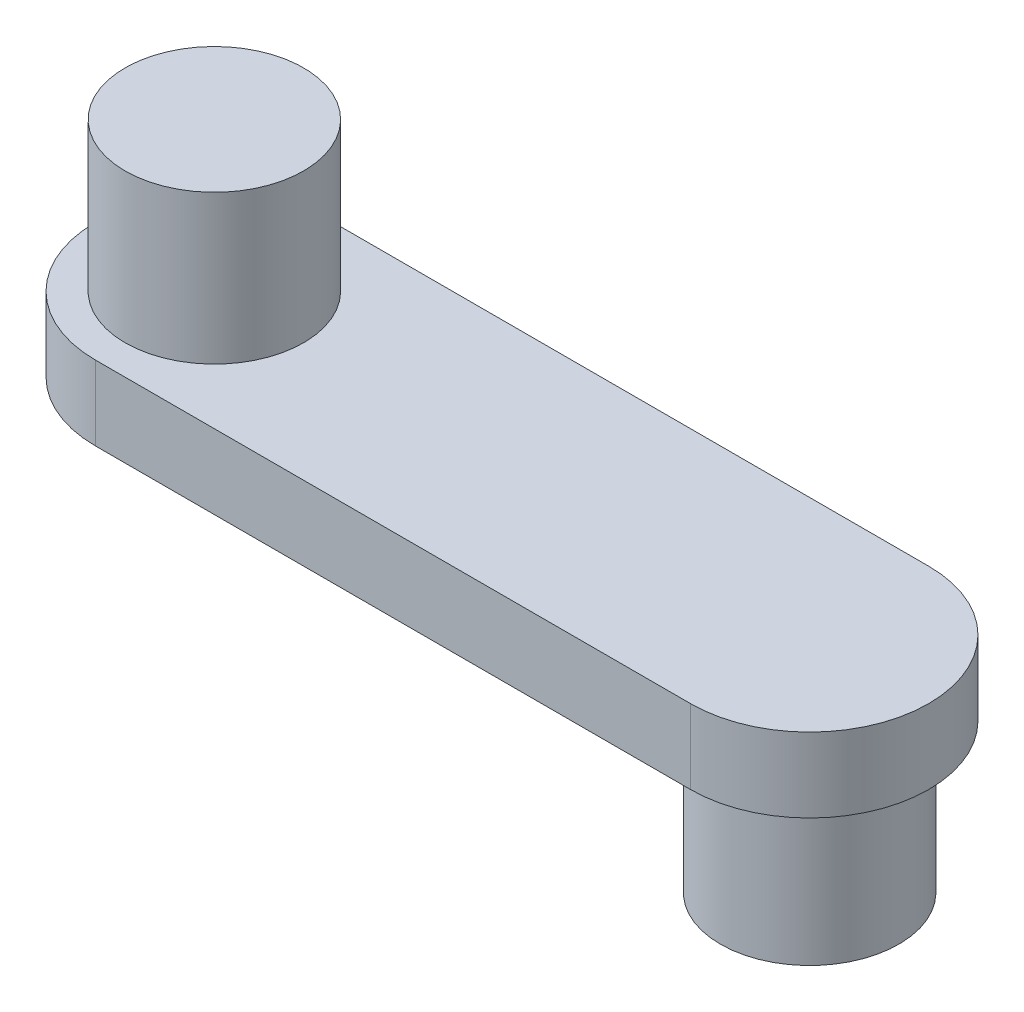
ISO-10303-21;
HEADER;
FILE_DESCRIPTION(('STEP AP214'),'2;1');
FILE_NAME('part.step','',(''),(''),'','','');
FILE_SCHEMA(('AUTOMOTIVE_DESIGN { 1 0 10303 214 1 1 1 1 }'));
ENDSEC;
DATA;
#1=APPLICATION_CONTEXT('core data for automotive mechanical design processes');
#2=APPLICATION_PROTOCOL_DEFINITION('international standard','automotive_design',2000,#1);
#3=PRODUCT_CONTEXT('',#1,'mechanical');
#4=PRODUCT('Part','Part','',(#3));
#5=PRODUCT_RELATED_PRODUCT_CATEGORY('part','',(#4));
#6=PRODUCT_DEFINITION_FORMATION('','',#4);
#7=PRODUCT_DEFINITION_CONTEXT('part definition',#1,'design');
#8=PRODUCT_DEFINITION('design','',#6,#7);
#9=PRODUCT_DEFINITION_SHAPE('','',#8);
#10=(LENGTH_UNIT() NAMED_UNIT(*) SI_UNIT(.MILLI.,.METRE.));
#11=(NAMED_UNIT(*) PLANE_ANGLE_UNIT() SI_UNIT($,.RADIAN.));
#12=(NAMED_UNIT(*) SI_UNIT($,.STERADIAN.) SOLID_ANGLE_UNIT());
#13=UNCERTAINTY_MEASURE_WITH_UNIT(LENGTH_MEASURE(1.E-05),#10,'distance_accuracy_value','');
#14=(GEOMETRIC_REPRESENTATION_CONTEXT(3) GLOBAL_UNCERTAINTY_ASSIGNED_CONTEXT((#13)) GLOBAL_UNIT_ASSIGNED_CONTEXT((#10,
#11,#12)) REPRESENTATION_CONTEXT('',''));
#15=CARTESIAN_POINT('',(0.,0.,0.));
#16=DIRECTION('',(0.,0.,1.));
#17=DIRECTION('',(1.,0.,0.));
#18=AXIS2_PLACEMENT_3D('',#15,#16,#17);
#19=CARTESIAN_POINT('',(0.,5.,8.));
#20=DIRECTION('',(0.,0.,-1.));
#21=DIRECTION('',(-1.,0.,0.));
#22=AXIS2_PLACEMENT_3D('',#19,#20,#21);
#23=PLANE('',#22);
#24=DIRECTION('',(1.,0.,0.));
#25=VECTOR('',#24,1.);
#26=CARTESIAN_POINT('',(0.,0.,8.));
#27=LINE('',#26,#25);
#28=CARTESIAN_POINT('',(0.,0.,8.));
#29=VERTEX_POINT('',#28);
#30=CARTESIAN_POINT('',(40.,0.,8.));
#31=VERTEX_POINT('',#30);
#32=EDGE_CURVE('E97',#29,#31,#27,.T.);
#33=ORIENTED_EDGE('',*,*,#32,.T.);
#34=DIRECTION('',(0.,-1.,0.));
#35=VECTOR('',#34,1.);
#36=CARTESIAN_POINT('',(40.,5.,8.));
#37=LINE('',#36,#35);
#38=CARTESIAN_POINT('',(40.,5.,8.));
#39=VERTEX_POINT('',#38);
#40=EDGE_CURVE('E11',#39,#31,#37,.T.);
#41=ORIENTED_EDGE('',*,*,#40,.F.);
#42=DIRECTION('',(1.,0.,0.));
#43=VECTOR('',#42,1.);
#44=CARTESIAN_POINT('',(0.,5.,8.));
#45=LINE('',#44,#43);
#46=CARTESIAN_POINT('',(0.,5.,8.));
#47=VERTEX_POINT('',#46);
#48=EDGE_CURVE('E82',#47,#39,#45,.T.);
#49=ORIENTED_EDGE('',*,*,#48,.F.);
#50=DIRECTION('',(0.,-1.,0.));
#51=VECTOR('',#50,1.);
#52=CARTESIAN_POINT('',(0.,5.,8.));
#53=LINE('',#52,#51);
#54=EDGE_CURVE('E93',#47,#29,#53,.T.);
#55=ORIENTED_EDGE('',*,*,#54,.T.);
#56=EDGE_LOOP('',(#33,#41,#49,#55));
#57=FACE_BOUND('',#56,.T.);
#58=ADVANCED_FACE('F35',(#57),#23,.F.);
#59=CARTESIAN_POINT('',(40.,5.,0.));
#60=DIRECTION('',(0.,-1.,0.));
#61=DIRECTION('',(0.,0.,-1.));
#62=AXIS2_PLACEMENT_3D('',#59,#60,#61);
#63=CYLINDRICAL_SURFACE('',#62,8.);
#64=CARTESIAN_POINT('',(40.,0.,0.));
#65=DIRECTION('',(0.,1.,0.));
#66=DIRECTION('',(0.,0.,1.));
#67=AXIS2_PLACEMENT_3D('',#64,#65,#66);
#68=CIRCLE('',#67,8.);
#69=CARTESIAN_POINT('',(40.,0.,-8.));
#70=VERTEX_POINT('',#69);
#71=EDGE_CURVE('E87',#31,#70,#68,.T.);
#72=ORIENTED_EDGE('',*,*,#71,.T.);
#73=DIRECTION('',(0.,-1.,0.));
#74=VECTOR('',#73,1.);
#75=CARTESIAN_POINT('',(40.,5.,-8.));
#76=LINE('',#75,#74);
#77=CARTESIAN_POINT('',(40.,5.,-8.));
#78=VERTEX_POINT('',#77);
#79=EDGE_CURVE('E43',#78,#70,#76,.T.);
#80=ORIENTED_EDGE('',*,*,#79,.F.);
#81=CARTESIAN_POINT('',(40.,5.,0.));
#82=DIRECTION('',(0.,1.,0.));
#83=DIRECTION('',(0.,0.,1.));
#84=AXIS2_PLACEMENT_3D('',#81,#82,#83);
#85=CIRCLE('',#84,8.);
#86=EDGE_CURVE('E77',#39,#78,#85,.T.);
#87=ORIENTED_EDGE('',*,*,#86,.F.);
#88=ORIENTED_EDGE('',*,*,#40,.T.);
#89=EDGE_LOOP('',(#72,#80,#87,#88));
#90=FACE_BOUND('',#89,.T.);
#91=ADVANCED_FACE('F86',(#90),#63,.T.);
#92=CARTESIAN_POINT('',(0.,5.,-8.));
#93=DIRECTION('',(0.,0.,-1.));
#94=DIRECTION('',(-1.,0.,0.));
#95=AXIS2_PLACEMENT_3D('',#92,#93,#94);
#96=PLANE('',#95);
#97=DIRECTION('',(1.,0.,0.));
#98=VECTOR('',#97,1.);
#99=CARTESIAN_POINT('',(0.,0.,-8.));
#100=LINE('',#99,#98);
#101=CARTESIAN_POINT('',(0.,0.,-8.));
#102=VERTEX_POINT('',#101);
#103=EDGE_CURVE('E102',#102,#70,#100,.T.);
#104=ORIENTED_EDGE('',*,*,#103,.F.);
#105=DIRECTION('',(0.,-1.,0.));
#106=VECTOR('',#105,1.);
#107=CARTESIAN_POINT('',(0.,5.,-8.));
#108=LINE('',#107,#106);
#109=CARTESIAN_POINT('',(0.,5.,-8.));
#110=VERTEX_POINT('',#109);
#111=EDGE_CURVE('E67',#110,#102,#108,.T.);
#112=ORIENTED_EDGE('',*,*,#111,.F.);
#113=DIRECTION('',(1.,0.,0.));
#114=VECTOR('',#113,1.);
#115=CARTESIAN_POINT('',(0.,5.,-8.));
#116=LINE('',#115,#114);
#117=EDGE_CURVE('E80',#110,#78,#116,.T.);
#118=ORIENTED_EDGE('',*,*,#117,.T.);
#119=ORIENTED_EDGE('',*,*,#79,.T.);
#120=EDGE_LOOP('',(#104,#112,#118,#119));
#121=FACE_BOUND('',#120,.T.);
#122=ADVANCED_FACE('F91',(#121),#96,.T.);
#123=CARTESIAN_POINT('',(0.,5.,0.));
#124=DIRECTION('',(0.,-1.,0.));
#125=DIRECTION('',(0.,0.,-1.));
#126=AXIS2_PLACEMENT_3D('',#123,#124,#125);
#127=CYLINDRICAL_SURFACE('',#126,8.);
#128=CARTESIAN_POINT('',(0.,0.,0.));
#129=DIRECTION('',(0.,1.,0.));
#130=DIRECTION('',(0.,0.,1.));
#131=AXIS2_PLACEMENT_3D('',#128,#129,#130);
#132=CIRCLE('',#131,8.);
#133=EDGE_CURVE('E70',#102,#29,#132,.T.);
#134=ORIENTED_EDGE('',*,*,#133,.T.);
#135=ORIENTED_EDGE('',*,*,#54,.F.);
#136=CARTESIAN_POINT('',(0.,5.,0.));
#137=DIRECTION('',(0.,1.,0.));
#138=DIRECTION('',(0.,0.,1.));
#139=AXIS2_PLACEMENT_3D('',#136,#137,#138);
#140=CIRCLE('',#139,8.);
#141=EDGE_CURVE('E51',#110,#47,#140,.T.);
#142=ORIENTED_EDGE('',*,*,#141,.F.);
#143=ORIENTED_EDGE('',*,*,#111,.T.);
#144=EDGE_LOOP('',(#134,#135,#142,#143));
#145=FACE_BOUND('',#144,.T.);
#146=ADVANCED_FACE('F121',(#145),#127,.T.);
#147=CARTESIAN_POINT('',(0.,5.,0.));
#148=DIRECTION('',(0.,1.,0.));
#149=DIRECTION('',(0.,0.,1.));
#150=AXIS2_PLACEMENT_3D('',#147,#148,#149);
#151=PLANE('',#150);
#152=CARTESIAN_POINT('',(0.,5.,0.));
#153=DIRECTION('',(0.,1.,0.));
#154=DIRECTION('',(0.,0.,1.));
#155=AXIS2_PLACEMENT_3D('',#152,#153,#154);
#156=CIRCLE('',#155,6.);
#157=CARTESIAN_POINT('',(0.,5.,6.));
#158=VERTEX_POINT('',#157);
#159=EDGE_CURVE('E100',#158,#158,#156,.F.);
#160=ORIENTED_EDGE('',*,*,#159,.T.);
#161=EDGE_LOOP('',(#160));
#162=FACE_BOUND('',#161,.T.);
#163=ORIENTED_EDGE('',*,*,#48,.T.);
#164=ORIENTED_EDGE('',*,*,#86,.T.);
#165=ORIENTED_EDGE('',*,*,#117,.F.);
#166=ORIENTED_EDGE('',*,*,#141,.T.);
#167=EDGE_LOOP('',(#163,#164,#165,#166));
#168=FACE_BOUND('',#167,.T.);
#169=ADVANCED_FACE('F78',(#162,#168),#151,.T.);
#170=CARTESIAN_POINT('',(0.,0.,0.));
#171=DIRECTION('',(0.,1.,0.));
#172=DIRECTION('',(0.,0.,1.));
#173=AXIS2_PLACEMENT_3D('',#170,#171,#172);
#174=PLANE('',#173);
#175=CARTESIAN_POINT('',(40.,0.,0.));
#176=DIRECTION('',(0.,1.,0.));
#177=DIRECTION('',(0.,0.,1.));
#178=AXIS2_PLACEMENT_3D('',#175,#176,#177);
#179=CIRCLE('',#178,6.00000000000001);
#180=CARTESIAN_POINT('',(40.,0.,6.00000000000001));
#181=VERTEX_POINT('',#180);
#182=EDGE_CURVE('E190',#181,#181,#179,.T.);
#183=ORIENTED_EDGE('',*,*,#182,.T.);
#184=EDGE_LOOP('',(#183));
#185=FACE_BOUND('',#184,.T.);
#186=ORIENTED_EDGE('',*,*,#32,.F.);
#187=ORIENTED_EDGE('',*,*,#133,.F.);
#188=ORIENTED_EDGE('',*,*,#103,.T.);
#189=ORIENTED_EDGE('',*,*,#71,.F.);
#190=EDGE_LOOP('',(#186,#187,#188,#189));
#191=FACE_BOUND('',#190,.T.);
#192=ADVANCED_FACE('F109',(#185,#191),#174,.F.);
#193=CARTESIAN_POINT('',(0.,15.,0.));
#194=DIRECTION('',(0.,-1.,0.));
#195=DIRECTION('',(0.,0.,-1.));
#196=AXIS2_PLACEMENT_3D('',#193,#194,#195);
#197=CYLINDRICAL_SURFACE('',#196,6.);
#198=ORIENTED_EDGE('',*,*,#159,.F.);
#199=EDGE_LOOP('',(#198));
#200=FACE_BOUND('',#199,.T.);
#201=CARTESIAN_POINT('',(0.,15.,0.));
#202=DIRECTION('',(0.,1.,0.));
#203=DIRECTION('',(0.,0.,1.));
#204=AXIS2_PLACEMENT_3D('',#201,#202,#203);
#205=CIRCLE('',#204,6.);
#206=CARTESIAN_POINT('',(0.,15.,6.));
#207=VERTEX_POINT('',#206);
#208=EDGE_CURVE('E189',#207,#207,#205,.T.);
#209=ORIENTED_EDGE('',*,*,#208,.F.);
#210=EDGE_LOOP('',(#209));
#211=FACE_BOUND('',#210,.T.);
#212=ADVANCED_FACE('F111',(#200,#211),#197,.T.);
#213=CARTESIAN_POINT('',(0.,15.,0.));
#214=DIRECTION('',(0.,1.,0.));
#215=DIRECTION('',(0.,0.,1.));
#216=AXIS2_PLACEMENT_3D('',#213,#214,#215);
#217=PLANE('',#216);
#218=ORIENTED_EDGE('',*,*,#208,.T.);
#219=EDGE_LOOP('',(#218));
#220=FACE_BOUND('',#219,.T.);
#221=ADVANCED_FACE('F118',(#220),#217,.T.);
#222=CARTESIAN_POINT('',(40.,-10.,0.));
#223=DIRECTION('',(0.,1.,0.));
#224=DIRECTION('',(0.,0.,1.));
#225=AXIS2_PLACEMENT_3D('',#222,#223,#224);
#226=CYLINDRICAL_SURFACE('',#225,6.00000000000001);
#227=CARTESIAN_POINT('',(40.,-10.,0.));
#228=DIRECTION('',(0.,1.,0.));
#229=DIRECTION('',(0.,0.,1.));
#230=AXIS2_PLACEMENT_3D('',#227,#228,#229);
#231=CIRCLE('',#230,6.00000000000001);
#232=CARTESIAN_POINT('',(40.,-10.,6.00000000000001));
#233=VERTEX_POINT('',#232);
#234=EDGE_CURVE('E188',#233,#233,#231,.T.);
#235=ORIENTED_EDGE('',*,*,#234,.T.);
#236=EDGE_LOOP('',(#235));
#237=FACE_BOUND('',#236,.T.);
#238=ORIENTED_EDGE('',*,*,#182,.F.);
#239=EDGE_LOOP('',(#238));
#240=FACE_BOUND('',#239,.T.);
#241=ADVANCED_FACE('F158',(#237,#240),#226,.T.);
#242=CARTESIAN_POINT('',(40.,-10.,0.));
#243=DIRECTION('',(0.,1.,0.));
#244=DIRECTION('',(0.,0.,1.));
#245=AXIS2_PLACEMENT_3D('',#242,#243,#244);
#246=PLANE('',#245);
#247=ORIENTED_EDGE('',*,*,#234,.F.);
#248=EDGE_LOOP('',(#247));
#249=FACE_BOUND('',#248,.T.);
#250=ADVANCED_FACE('F172',(#249),#246,.F.);
#251=CLOSED_SHELL('',(#58,#91,#122,#146,#169,#192,#212,#221,#241,#250));
#252=MANIFOLD_SOLID_BREP('B2',#251);
#253=ADVANCED_BREP_SHAPE_REPRESENTATION('',(#18,#252),#14);
#254=SHAPE_DEFINITION_REPRESENTATION(#9,#253);
ENDSEC;
END-ISO-10303-21;
